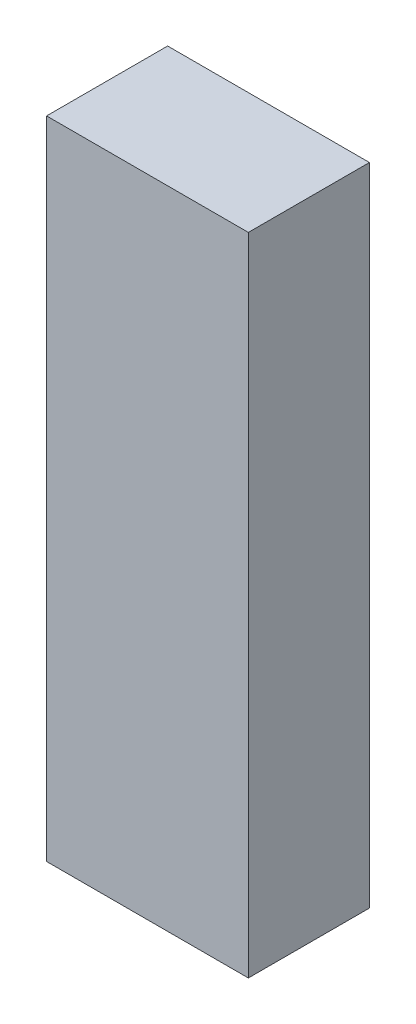
ISO-10303-21;
HEADER;
FILE_DESCRIPTION(('STEP AP214'),'2;1');
FILE_NAME('part.step','',(''),(''),'','','');
FILE_SCHEMA(('AUTOMOTIVE_DESIGN { 1 0 10303 214 1 1 1 1 }'));
ENDSEC;
DATA;
#1=APPLICATION_CONTEXT('core data for automotive mechanical design processes');
#2=APPLICATION_PROTOCOL_DEFINITION('international standard','automotive_design',2000,#1);
#3=PRODUCT_CONTEXT('',#1,'mechanical');
#4=PRODUCT('Part','Part','',(#3));
#5=PRODUCT_RELATED_PRODUCT_CATEGORY('part','',(#4));
#6=PRODUCT_DEFINITION_FORMATION('','',#4);
#7=PRODUCT_DEFINITION_CONTEXT('part definition',#1,'design');
#8=PRODUCT_DEFINITION('design','',#6,#7);
#9=PRODUCT_DEFINITION_SHAPE('','',#8);
#10=(LENGTH_UNIT() NAMED_UNIT(*) SI_UNIT(.MILLI.,.METRE.));
#11=(NAMED_UNIT(*) PLANE_ANGLE_UNIT() SI_UNIT($,.RADIAN.));
#12=(NAMED_UNIT(*) SI_UNIT($,.STERADIAN.) SOLID_ANGLE_UNIT());
#13=UNCERTAINTY_MEASURE_WITH_UNIT(LENGTH_MEASURE(1.E-05),#10,'distance_accuracy_value','');
#14=(GEOMETRIC_REPRESENTATION_CONTEXT(3) GLOBAL_UNCERTAINTY_ASSIGNED_CONTEXT((#13)) GLOBAL_UNIT_ASSIGNED_CONTEXT((#10,
#11,#12)) REPRESENTATION_CONTEXT('',''));
#15=CARTESIAN_POINT('',(0.,0.,0.));
#16=DIRECTION('',(0.,0.,1.));
#17=DIRECTION('',(1.,0.,0.));
#18=AXIS2_PLACEMENT_3D('',#15,#16,#17);
#19=CARTESIAN_POINT('',(0.,0.,7.62));
#20=DIRECTION('',(1.,0.,0.));
#21=DIRECTION('',(0.,1.,0.));
#22=AXIS2_PLACEMENT_3D('',#19,#20,#21);
#23=PLANE('',#22);
#24=DIRECTION('',(0.,-1.,0.));
#25=VECTOR('',#24,1.);
#26=CARTESIAN_POINT('',(0.,0.,0.));
#27=LINE('',#26,#25);
#28=CARTESIAN_POINT('',(0.,40.64,0.));
#29=VERTEX_POINT('',#28);
#30=CARTESIAN_POINT('',(0.,0.,0.));
#31=VERTEX_POINT('',#30);
#32=EDGE_CURVE('E96',#29,#31,#27,.T.);
#33=ORIENTED_EDGE('',*,*,#32,.T.);
#34=DIRECTION('',(0.,0.,-1.));
#35=VECTOR('',#34,1.);
#36=CARTESIAN_POINT('',(0.,0.,7.62));
#37=LINE('',#36,#35);
#38=CARTESIAN_POINT('',(0.,0.,7.62));
#39=VERTEX_POINT('',#38);
#40=EDGE_CURVE('E11',#39,#31,#37,.T.);
#41=ORIENTED_EDGE('',*,*,#40,.F.);
#42=DIRECTION('',(0.,-1.,0.));
#43=VECTOR('',#42,1.);
#44=CARTESIAN_POINT('',(0.,0.,7.62));
#45=LINE('',#44,#43);
#46=CARTESIAN_POINT('',(0.,40.64,7.62));
#47=VERTEX_POINT('',#46);
#48=EDGE_CURVE('E84',#47,#39,#45,.T.);
#49=ORIENTED_EDGE('',*,*,#48,.F.);
#50=DIRECTION('',(0.,0.,-1.));
#51=VECTOR('',#50,1.);
#52=CARTESIAN_POINT('',(0.,40.64,7.62));
#53=LINE('',#52,#51);
#54=EDGE_CURVE('E92',#47,#29,#53,.T.);
#55=ORIENTED_EDGE('',*,*,#54,.T.);
#56=EDGE_LOOP('',(#33,#41,#49,#55));
#57=FACE_BOUND('',#56,.T.);
#58=ADVANCED_FACE('F33',(#57),#23,.F.);
#59=CARTESIAN_POINT('',(0.,0.,7.62));
#60=DIRECTION('',(0.,1.,0.));
#61=DIRECTION('',(0.,0.,1.));
#62=AXIS2_PLACEMENT_3D('',#59,#60,#61);
#63=PLANE('',#62);
#64=DIRECTION('',(1.,0.,0.));
#65=VECTOR('',#64,1.);
#66=CARTESIAN_POINT('',(0.,0.,0.));
#67=LINE('',#66,#65);
#68=CARTESIAN_POINT('',(12.7,0.,0.));
#69=VERTEX_POINT('',#68);
#70=EDGE_CURVE('E88',#31,#69,#67,.T.);
#71=ORIENTED_EDGE('',*,*,#70,.T.);
#72=DIRECTION('',(0.,0.,-1.));
#73=VECTOR('',#72,1.);
#74=CARTESIAN_POINT('',(12.7,0.,7.62));
#75=LINE('',#74,#73);
#76=CARTESIAN_POINT('',(12.7,0.,7.62));
#77=VERTEX_POINT('',#76);
#78=EDGE_CURVE('E41',#77,#69,#75,.T.);
#79=ORIENTED_EDGE('',*,*,#78,.F.);
#80=DIRECTION('',(1.,0.,0.));
#81=VECTOR('',#80,1.);
#82=CARTESIAN_POINT('',(0.,0.,7.62));
#83=LINE('',#82,#81);
#84=EDGE_CURVE('E79',#39,#77,#83,.T.);
#85=ORIENTED_EDGE('',*,*,#84,.F.);
#86=ORIENTED_EDGE('',*,*,#40,.T.);
#87=EDGE_LOOP('',(#71,#79,#85,#86));
#88=FACE_BOUND('',#87,.T.);
#89=ADVANCED_FACE('F87',(#88),#63,.F.);
#90=CARTESIAN_POINT('',(12.7,0.,7.62));
#91=DIRECTION('',(-1.,0.,0.));
#92=DIRECTION('',(0.,-1.,0.));
#93=AXIS2_PLACEMENT_3D('',#90,#91,#92);
#94=PLANE('',#93);
#95=DIRECTION('',(0.,1.,0.));
#96=VECTOR('',#95,1.);
#97=CARTESIAN_POINT('',(12.7,0.,0.));
#98=LINE('',#97,#96);
#99=CARTESIAN_POINT('',(12.7,40.64,0.));
#100=VERTEX_POINT('',#99);
#101=EDGE_CURVE('E66',#69,#100,#98,.T.);
#102=ORIENTED_EDGE('',*,*,#101,.T.);
#103=DIRECTION('',(0.,0.,-1.));
#104=VECTOR('',#103,1.);
#105=CARTESIAN_POINT('',(12.7,40.64,7.62));
#106=LINE('',#105,#104);
#107=CARTESIAN_POINT('',(12.7,40.64,7.62));
#108=VERTEX_POINT('',#107);
#109=EDGE_CURVE('E89',#108,#100,#106,.T.);
#110=ORIENTED_EDGE('',*,*,#109,.F.);
#111=DIRECTION('',(0.,1.,0.));
#112=VECTOR('',#111,1.);
#113=CARTESIAN_POINT('',(12.7,0.,7.62));
#114=LINE('',#113,#112);
#115=EDGE_CURVE('E82',#77,#108,#114,.T.);
#116=ORIENTED_EDGE('',*,*,#115,.F.);
#117=ORIENTED_EDGE('',*,*,#78,.T.);
#118=EDGE_LOOP('',(#102,#110,#116,#117));
#119=FACE_BOUND('',#118,.T.);
#120=ADVANCED_FACE('F90',(#119),#94,.F.);
#121=CARTESIAN_POINT('',(0.,40.64,7.62));
#122=DIRECTION('',(0.,-1.,0.));
#123=DIRECTION('',(0.,0.,-1.));
#124=AXIS2_PLACEMENT_3D('',#121,#122,#123);
#125=PLANE('',#124);
#126=DIRECTION('',(-1.,0.,0.));
#127=VECTOR('',#126,1.);
#128=CARTESIAN_POINT('',(0.,40.64,0.));
#129=LINE('',#128,#127);
#130=EDGE_CURVE('E72',#100,#29,#129,.T.);
#131=ORIENTED_EDGE('',*,*,#130,.T.);
#132=ORIENTED_EDGE('',*,*,#54,.F.);
#133=DIRECTION('',(-1.,0.,0.));
#134=VECTOR('',#133,1.);
#135=CARTESIAN_POINT('',(0.,40.64,7.62));
#136=LINE('',#135,#134);
#137=EDGE_CURVE('E49',#108,#47,#136,.T.);
#138=ORIENTED_EDGE('',*,*,#137,.F.);
#139=ORIENTED_EDGE('',*,*,#109,.T.);
#140=EDGE_LOOP('',(#131,#132,#138,#139));
#141=FACE_BOUND('',#140,.T.);
#142=ADVANCED_FACE('F103',(#141),#125,.F.);
#143=CARTESIAN_POINT('',(0.,0.,7.62));
#144=DIRECTION('',(0.,0.,-1.));
#145=DIRECTION('',(-1.,0.,0.));
#146=AXIS2_PLACEMENT_3D('',#143,#144,#145);
#147=PLANE('',#146);
#148=ORIENTED_EDGE('',*,*,#48,.T.);
#149=ORIENTED_EDGE('',*,*,#84,.T.);
#150=ORIENTED_EDGE('',*,*,#115,.T.);
#151=ORIENTED_EDGE('',*,*,#137,.T.);
#152=EDGE_LOOP('',(#148,#149,#150,#151));
#153=FACE_BOUND('',#152,.T.);
#154=ADVANCED_FACE('F80',(#153),#147,.F.);
#155=CARTESIAN_POINT('',(0.,0.,0.));
#156=DIRECTION('',(0.,0.,-1.));
#157=DIRECTION('',(-1.,0.,0.));
#158=AXIS2_PLACEMENT_3D('',#155,#156,#157);
#159=PLANE('',#158);
#160=ORIENTED_EDGE('',*,*,#32,.F.);
#161=ORIENTED_EDGE('',*,*,#130,.F.);
#162=ORIENTED_EDGE('',*,*,#101,.F.);
#163=ORIENTED_EDGE('',*,*,#70,.F.);
#164=EDGE_LOOP('',(#160,#161,#162,#163));
#165=FACE_BOUND('',#164,.T.);
#166=ADVANCED_FACE('F106',(#165),#159,.T.);
#167=CLOSED_SHELL('',(#58,#89,#120,#142,#154,#166));
#168=MANIFOLD_SOLID_BREP('B2',#167);
#169=ADVANCED_BREP_SHAPE_REPRESENTATION('',(#18,#168),#14);
#170=SHAPE_DEFINITION_REPRESENTATION(#9,#169);
ENDSEC;
END-ISO-10303-21;
